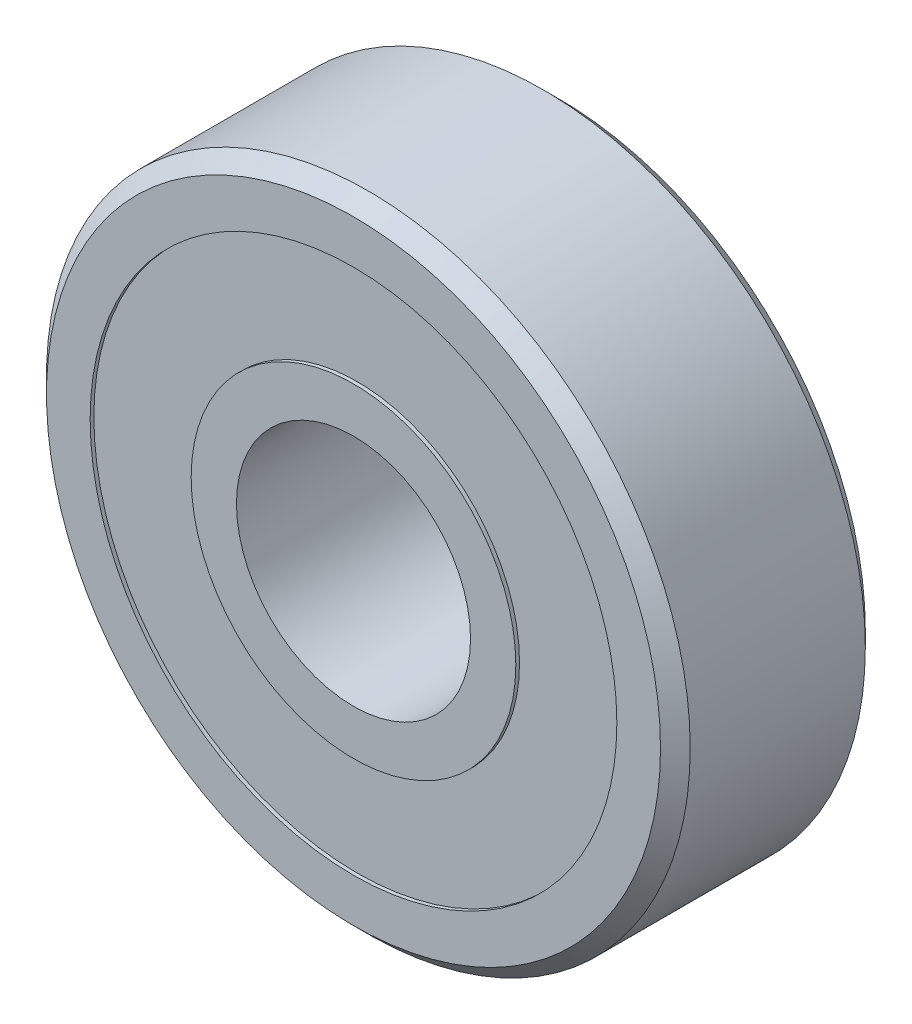
ISO-10303-21;
HEADER;
FILE_DESCRIPTION(('STEP AP214'),'2;1');
FILE_NAME('part.step','',(''),(''),'','','');
FILE_SCHEMA(('AUTOMOTIVE_DESIGN { 1 0 10303 214 1 1 1 1 }'));
ENDSEC;
DATA;
#1=APPLICATION_CONTEXT('core data for automotive mechanical design processes');
#2=APPLICATION_PROTOCOL_DEFINITION('international standard','automotive_design',2000,#1);
#3=PRODUCT_CONTEXT('',#1,'mechanical');
#4=PRODUCT('Part','Part','',(#3));
#5=PRODUCT_RELATED_PRODUCT_CATEGORY('part','',(#4));
#6=PRODUCT_DEFINITION_FORMATION('','',#4);
#7=PRODUCT_DEFINITION_CONTEXT('part definition',#1,'design');
#8=PRODUCT_DEFINITION('design','',#6,#7);
#9=PRODUCT_DEFINITION_SHAPE('','',#8);
#10=(LENGTH_UNIT() NAMED_UNIT(*) SI_UNIT(.MILLI.,.METRE.));
#11=(NAMED_UNIT(*) PLANE_ANGLE_UNIT() SI_UNIT($,.RADIAN.));
#12=(NAMED_UNIT(*) SI_UNIT($,.STERADIAN.) SOLID_ANGLE_UNIT());
#13=UNCERTAINTY_MEASURE_WITH_UNIT(LENGTH_MEASURE(1.E-05),#10,'distance_accuracy_value','');
#14=(GEOMETRIC_REPRESENTATION_CONTEXT(3) GLOBAL_UNCERTAINTY_ASSIGNED_CONTEXT((#13)) GLOBAL_UNIT_ASSIGNED_CONTEXT((#10,
#11,#12)) REPRESENTATION_CONTEXT('',''));
#15=CARTESIAN_POINT('',(0.,0.,0.));
#16=DIRECTION('',(0.,0.,1.));
#17=DIRECTION('',(1.,0.,0.));
#18=AXIS2_PLACEMENT_3D('',#15,#16,#17);
#19=CARTESIAN_POINT('',(0.,0.,-7.));
#20=DIRECTION('',(0.,0.,-1.));
#21=DIRECTION('',(1.,0.,0.));
#22=AXIS2_PLACEMENT_3D('',#19,#20,#21);
#23=PLANE('',#22);
#24=CARTESIAN_POINT('',(0.,0.,-7.));
#25=DIRECTION('',(0.,0.,1.));
#26=DIRECTION('',(1.,0.,0.));
#27=AXIS2_PLACEMENT_3D('',#24,#25,#26);
#28=CIRCLE('',#27,4.50800000000001);
#29=CARTESIAN_POINT('',(4.50800000000001,0.,-7.));
#30=VERTEX_POINT('',#29);
#31=EDGE_CURVE('E10',#30,#30,#28,.F.);
#32=ORIENTED_EDGE('',*,*,#31,.F.);
#33=EDGE_LOOP('',(#32));
#34=FACE_BOUND('',#33,.T.);
#35=CARTESIAN_POINT('',(0.,0.,-7.));
#36=DIRECTION('',(0.,0.,-1.));
#37=DIRECTION('',(-1.,0.,0.));
#38=AXIS2_PLACEMENT_3D('',#35,#36,#37);
#39=CIRCLE('',#38,5.54763491416447);
#40=CARTESIAN_POINT('',(-5.54763491416447,0.,-7.));
#41=VERTEX_POINT('',#40);
#42=EDGE_CURVE('E89',#41,#41,#39,.T.);
#43=ORIENTED_EDGE('',*,*,#42,.T.);
#44=EDGE_LOOP('',(#43));
#45=FACE_BOUND('',#44,.T.);
#46=ADVANCED_FACE('F41',(#34,#45),#23,.T.);
#47=CARTESIAN_POINT('',(0.,0.,0.));
#48=DIRECTION('',(0.,0.,-1.));
#49=DIRECTION('',(1.,0.,0.));
#50=AXIS2_PLACEMENT_3D('',#47,#48,#49);
#51=PLANE('',#50);
#52=CARTESIAN_POINT('',(0.,0.,0.));
#53=DIRECTION('',(0.,0.,1.));
#54=DIRECTION('',(1.,0.,0.));
#55=AXIS2_PLACEMENT_3D('',#52,#53,#54);
#56=CIRCLE('',#55,4.);
#57=CARTESIAN_POINT('',(4.,0.,0.));
#58=VERTEX_POINT('',#57);
#59=EDGE_CURVE('E67',#58,#58,#56,.T.);
#60=ORIENTED_EDGE('',*,*,#59,.F.);
#61=EDGE_LOOP('',(#60));
#62=FACE_BOUND('',#61,.T.);
#63=CARTESIAN_POINT('',(0.,0.,0.));
#64=DIRECTION('',(0.,0.,-1.));
#65=DIRECTION('',(-1.,0.,0.));
#66=AXIS2_PLACEMENT_3D('',#63,#64,#65);
#67=CIRCLE('',#66,5.54763491416447);
#68=CARTESIAN_POINT('',(-5.54763491416447,0.,0.));
#69=VERTEX_POINT('',#68);
#70=EDGE_CURVE('E77',#69,#69,#67,.T.);
#71=ORIENTED_EDGE('',*,*,#70,.F.);
#72=EDGE_LOOP('',(#71));
#73=FACE_BOUND('',#72,.T.);
#74=ADVANCED_FACE('F115',(#62,#73),#51,.F.);
#75=CARTESIAN_POINT('',(0.,0.,-7.));
#76=DIRECTION('',(0.,0.,-1.));
#77=DIRECTION('',(-1.,0.,0.));
#78=AXIS2_PLACEMENT_3D('',#75,#76,#77);
#79=CIRCLE('',#78,9.00013023394548);
#80=CARTESIAN_POINT('',(-9.00013023394548,0.,-7.));
#81=VERTEX_POINT('',#80);
#82=EDGE_CURVE('E83',#81,#81,#79,.T.);
#83=ORIENTED_EDGE('',*,*,#82,.F.);
#84=EDGE_LOOP('',(#83));
#85=FACE_BOUND('',#84,.T.);
#86=CARTESIAN_POINT('',(0.,0.,-7.));
#87=DIRECTION('',(0.,0.,1.));
#88=DIRECTION('',(1.,0.,0.));
#89=AXIS2_PLACEMENT_3D('',#86,#87,#88);
#90=CIRCLE('',#89,10.492);
#91=CARTESIAN_POINT('',(10.492,0.,-7.));
#92=VERTEX_POINT('',#91);
#93=EDGE_CURVE('E48',#92,#92,#90,.T.);
#94=ORIENTED_EDGE('',*,*,#93,.F.);
#95=EDGE_LOOP('',(#94));
#96=FACE_BOUND('',#95,.T.);
#97=ADVANCED_FACE('F118',(#85,#96),#23,.T.);
#98=CARTESIAN_POINT('',(0.,0.,0.));
#99=DIRECTION('',(0.,0.,-1.));
#100=DIRECTION('',(-1.,0.,0.));
#101=AXIS2_PLACEMENT_3D('',#98,#99,#100);
#102=CIRCLE('',#101,9.00013023394548);
#103=CARTESIAN_POINT('',(-9.00013023394548,0.,0.));
#104=VERTEX_POINT('',#103);
#105=EDGE_CURVE('E71',#104,#104,#102,.T.);
#106=ORIENTED_EDGE('',*,*,#105,.T.);
#107=EDGE_LOOP('',(#106));
#108=FACE_BOUND('',#107,.T.);
#109=CARTESIAN_POINT('',(0.,0.,0.));
#110=DIRECTION('',(0.,0.,1.));
#111=DIRECTION('',(1.,0.,0.));
#112=AXIS2_PLACEMENT_3D('',#109,#110,#111);
#113=CIRCLE('',#112,10.492);
#114=CARTESIAN_POINT('',(10.492,0.,0.));
#115=VERTEX_POINT('',#114);
#116=EDGE_CURVE('E56',#115,#115,#113,.F.);
#117=ORIENTED_EDGE('',*,*,#116,.F.);
#118=EDGE_LOOP('',(#117));
#119=FACE_BOUND('',#118,.T.);
#120=ADVANCED_FACE('F124',(#108,#119),#51,.F.);
#121=CARTESIAN_POINT('',(0.,0.,-7.));
#122=DIRECTION('',(0.,0.,1.));
#123=DIRECTION('',(-1.,0.,0.));
#124=AXIS2_PLACEMENT_3D('',#121,#122,#123);
#125=CYLINDRICAL_SURFACE('',#124,11.);
#126=CARTESIAN_POINT('',(0.,0.,-0.507999999999995));
#127=DIRECTION('',(0.,0.,1.));
#128=DIRECTION('',(1.,0.,0.));
#129=AXIS2_PLACEMENT_3D('',#126,#127,#128);
#130=CIRCLE('',#129,11.);
#131=CARTESIAN_POINT('',(11.,0.,-0.507999999999995));
#132=VERTEX_POINT('',#131);
#133=EDGE_CURVE('E61',#132,#132,#130,.T.);
#134=ORIENTED_EDGE('',*,*,#133,.F.);
#135=EDGE_LOOP('',(#134));
#136=FACE_BOUND('',#135,.T.);
#137=CARTESIAN_POINT('',(0.,0.,-6.49200000000001));
#138=DIRECTION('',(0.,0.,1.));
#139=DIRECTION('',(1.,0.,0.));
#140=AXIS2_PLACEMENT_3D('',#137,#138,#139);
#141=CIRCLE('',#140,11.);
#142=CARTESIAN_POINT('',(11.,0.,-6.49200000000001));
#143=VERTEX_POINT('',#142);
#144=EDGE_CURVE('E64',#143,#143,#141,.F.);
#145=ORIENTED_EDGE('',*,*,#144,.F.);
#146=EDGE_LOOP('',(#145));
#147=FACE_BOUND('',#146,.T.);
#148=ADVANCED_FACE('F132',(#136,#147),#125,.T.);
#149=CARTESIAN_POINT('',(0.,0.,-7.));
#150=DIRECTION('',(0.,0.,1.));
#151=DIRECTION('',(-1.,0.,0.));
#152=AXIS2_PLACEMENT_3D('',#149,#150,#151);
#153=CYLINDRICAL_SURFACE('',#152,4.);
#154=CARTESIAN_POINT('',(0.,0.,-6.492));
#155=DIRECTION('',(0.,0.,1.));
#156=DIRECTION('',(1.,0.,0.));
#157=AXIS2_PLACEMENT_3D('',#154,#155,#156);
#158=CIRCLE('',#157,4.);
#159=CARTESIAN_POINT('',(4.,0.,-6.492));
#160=VERTEX_POINT('',#159);
#161=EDGE_CURVE('E52',#160,#160,#158,.T.);
#162=ORIENTED_EDGE('',*,*,#161,.F.);
#163=EDGE_LOOP('',(#162));
#164=FACE_BOUND('',#163,.T.);
#165=ORIENTED_EDGE('',*,*,#59,.T.);
#166=EDGE_LOOP('',(#165));
#167=FACE_BOUND('',#166,.T.);
#168=ADVANCED_FACE('F140',(#164,#167),#153,.F.);
#169=CARTESIAN_POINT('',(0.,0.,-0.507999999999995));
#170=DIRECTION('',(0.,0.,-1.));
#171=DIRECTION('',(1.,0.,0.));
#172=AXIS2_PLACEMENT_3D('',#169,#170,#171);
#173=CONICAL_SURFACE('',#172,11.,0.785398163397452);
#174=ORIENTED_EDGE('',*,*,#116,.T.);
#175=EDGE_LOOP('',(#174));
#176=FACE_BOUND('',#175,.T.);
#177=ORIENTED_EDGE('',*,*,#133,.T.);
#178=EDGE_LOOP('',(#177));
#179=FACE_BOUND('',#178,.T.);
#180=ADVANCED_FACE('F145',(#176,#179),#173,.T.);
#181=CARTESIAN_POINT('',(0.,0.,-6.492));
#182=DIRECTION('',(0.,0.,-1.));
#183=DIRECTION('',(1.,0.,0.));
#184=AXIS2_PLACEMENT_3D('',#181,#182,#183);
#185=CONICAL_SURFACE('',#184,4.,0.785398163397452);
#186=ORIENTED_EDGE('',*,*,#31,.T.);
#187=EDGE_LOOP('',(#186));
#188=FACE_BOUND('',#187,.T.);
#189=ORIENTED_EDGE('',*,*,#161,.T.);
#190=EDGE_LOOP('',(#189));
#191=FACE_BOUND('',#190,.T.);
#192=ADVANCED_FACE('F147',(#188,#191),#185,.F.);
#193=CARTESIAN_POINT('',(0.,0.,-7.));
#194=DIRECTION('',(0.,0.,1.));
#195=DIRECTION('',(-1.,0.,0.));
#196=AXIS2_PLACEMENT_3D('',#193,#194,#195);
#197=CONICAL_SURFACE('',#196,10.492,0.785398163397448);
#198=ORIENTED_EDGE('',*,*,#144,.T.);
#199=EDGE_LOOP('',(#198));
#200=FACE_BOUND('',#199,.T.);
#201=ORIENTED_EDGE('',*,*,#93,.T.);
#202=EDGE_LOOP('',(#201));
#203=FACE_BOUND('',#202,.T.);
#204=ADVANCED_FACE('F43',(#200,#203),#197,.T.);
#205=CARTESIAN_POINT('',(0.,0.,-0.127));
#206=DIRECTION('',(0.,0.,1.));
#207=DIRECTION('',(-1.,0.,0.));
#208=AXIS2_PLACEMENT_3D('',#205,#206,#207);
#209=CYLINDRICAL_SURFACE('',#208,9.00013023394548);
#210=CARTESIAN_POINT('',(0.,0.,-0.127));
#211=DIRECTION('',(0.,0.,-1.));
#212=DIRECTION('',(-1.,0.,0.));
#213=AXIS2_PLACEMENT_3D('',#210,#211,#212);
#214=CIRCLE('',#213,9.00013023394548);
#215=CARTESIAN_POINT('',(-9.00013023394548,0.,-0.127));
#216=VERTEX_POINT('',#215);
#217=EDGE_CURVE('E70',#216,#216,#214,.T.);
#218=ORIENTED_EDGE('',*,*,#217,.T.);
#219=EDGE_LOOP('',(#218));
#220=FACE_BOUND('',#219,.T.);
#221=ORIENTED_EDGE('',*,*,#105,.F.);
#222=EDGE_LOOP('',(#221));
#223=FACE_BOUND('',#222,.T.);
#224=ADVANCED_FACE('F153',(#220,#223),#209,.F.);
#225=CARTESIAN_POINT('',(0.,0.,-0.127));
#226=DIRECTION('',(0.,0.,1.));
#227=DIRECTION('',(-1.,0.,0.));
#228=AXIS2_PLACEMENT_3D('',#225,#226,#227);
#229=PLANE('',#228);
#230=CARTESIAN_POINT('',(0.,0.,-0.127));
#231=DIRECTION('',(0.,0.,-1.));
#232=DIRECTION('',(-1.,0.,0.));
#233=AXIS2_PLACEMENT_3D('',#230,#231,#232);
#234=CIRCLE('',#233,5.54763491416447);
#235=CARTESIAN_POINT('',(-5.54763491416447,0.,-0.127));
#236=VERTEX_POINT('',#235);
#237=EDGE_CURVE('E74',#236,#236,#234,.T.);
#238=ORIENTED_EDGE('',*,*,#237,.T.);
#239=EDGE_LOOP('',(#238));
#240=FACE_BOUND('',#239,.T.);
#241=ORIENTED_EDGE('',*,*,#217,.F.);
#242=EDGE_LOOP('',(#241));
#243=FACE_BOUND('',#242,.T.);
#244=ADVANCED_FACE('F110',(#240,#243),#229,.T.);
#245=CARTESIAN_POINT('',(0.,0.,-0.127));
#246=DIRECTION('',(0.,0.,1.));
#247=DIRECTION('',(-1.,0.,0.));
#248=AXIS2_PLACEMENT_3D('',#245,#246,#247);
#249=CYLINDRICAL_SURFACE('',#248,5.54763491416447);
#250=ORIENTED_EDGE('',*,*,#237,.F.);
#251=EDGE_LOOP('',(#250));
#252=FACE_BOUND('',#251,.T.);
#253=ORIENTED_EDGE('',*,*,#70,.T.);
#254=EDGE_LOOP('',(#253));
#255=FACE_BOUND('',#254,.T.);
#256=ADVANCED_FACE('F101',(#252,#255),#249,.T.);
#257=CARTESIAN_POINT('',(0.,0.,-6.873));
#258=DIRECTION('',(0.,0.,-1.));
#259=DIRECTION('',(-1.,0.,0.));
#260=AXIS2_PLACEMENT_3D('',#257,#258,#259);
#261=PLANE('',#260);
#262=CARTESIAN_POINT('',(0.,0.,-6.873));
#263=DIRECTION('',(0.,0.,-1.));
#264=DIRECTION('',(-1.,0.,0.));
#265=AXIS2_PLACEMENT_3D('',#262,#263,#264);
#266=CIRCLE('',#265,9.00013023394548);
#267=CARTESIAN_POINT('',(-9.00013023394548,0.,-6.873));
#268=VERTEX_POINT('',#267);
#269=EDGE_CURVE('E80',#268,#268,#266,.T.);
#270=ORIENTED_EDGE('',*,*,#269,.T.);
#271=EDGE_LOOP('',(#270));
#272=FACE_BOUND('',#271,.T.);
#273=CARTESIAN_POINT('',(0.,0.,-6.873));
#274=DIRECTION('',(0.,0.,-1.));
#275=DIRECTION('',(-1.,0.,0.));
#276=AXIS2_PLACEMENT_3D('',#273,#274,#275);
#277=CIRCLE('',#276,5.54763491416447);
#278=CARTESIAN_POINT('',(-5.54763491416447,0.,-6.873));
#279=VERTEX_POINT('',#278);
#280=EDGE_CURVE('E86',#279,#279,#277,.T.);
#281=ORIENTED_EDGE('',*,*,#280,.F.);
#282=EDGE_LOOP('',(#281));
#283=FACE_BOUND('',#282,.T.);
#284=ADVANCED_FACE('F98',(#272,#283),#261,.T.);
#285=CARTESIAN_POINT('',(0.,0.,-6.873));
#286=DIRECTION('',(0.,0.,-1.));
#287=DIRECTION('',(1.,0.,0.));
#288=AXIS2_PLACEMENT_3D('',#285,#286,#287);
#289=CYLINDRICAL_SURFACE('',#288,9.00013023394548);
#290=ORIENTED_EDGE('',*,*,#269,.F.);
#291=EDGE_LOOP('',(#290));
#292=FACE_BOUND('',#291,.T.);
#293=ORIENTED_EDGE('',*,*,#82,.T.);
#294=EDGE_LOOP('',(#293));
#295=FACE_BOUND('',#294,.T.);
#296=ADVANCED_FACE('F100',(#292,#295),#289,.F.);
#297=CARTESIAN_POINT('',(0.,0.,-6.873));
#298=DIRECTION('',(0.,0.,-1.));
#299=DIRECTION('',(1.,0.,0.));
#300=AXIS2_PLACEMENT_3D('',#297,#298,#299);
#301=CYLINDRICAL_SURFACE('',#300,5.54763491416447);
#302=ORIENTED_EDGE('',*,*,#280,.T.);
#303=EDGE_LOOP('',(#302));
#304=FACE_BOUND('',#303,.T.);
#305=ORIENTED_EDGE('',*,*,#42,.F.);
#306=EDGE_LOOP('',(#305));
#307=FACE_BOUND('',#306,.T.);
#308=ADVANCED_FACE('F95',(#304,#307),#301,.T.);
#309=CLOSED_SHELL('',(#46,#74,#97,#120,#148,#168,#180,#192,#204,#224,#244,#256,#284,#296,#308));
#310=MANIFOLD_SOLID_BREP('B2',#309);
#311=ADVANCED_BREP_SHAPE_REPRESENTATION('',(#18,#310),#14);
#312=SHAPE_DEFINITION_REPRESENTATION(#9,#311);
ENDSEC;
END-ISO-10303-21;
